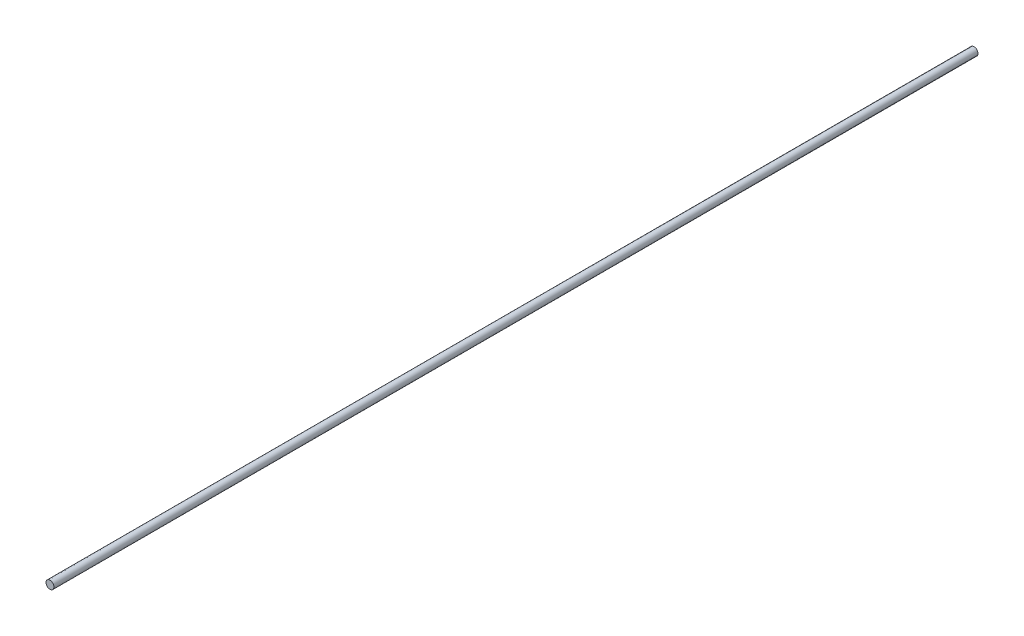
ISO-10303-21;
HEADER;
FILE_DESCRIPTION(('STEP AP214'),'2;1');
FILE_NAME('part.step','',(''),(''),'','','');
FILE_SCHEMA(('AUTOMOTIVE_DESIGN { 1 0 10303 214 1 1 1 1 }'));
ENDSEC;
DATA;
#1=APPLICATION_CONTEXT('core data for automotive mechanical design processes');
#2=APPLICATION_PROTOCOL_DEFINITION('international standard','automotive_design',2000,#1);
#3=PRODUCT_CONTEXT('',#1,'mechanical');
#4=PRODUCT('Part','Part','',(#3));
#5=PRODUCT_RELATED_PRODUCT_CATEGORY('part','',(#4));
#6=PRODUCT_DEFINITION_FORMATION('','',#4);
#7=PRODUCT_DEFINITION_CONTEXT('part definition',#1,'design');
#8=PRODUCT_DEFINITION('design','',#6,#7);
#9=PRODUCT_DEFINITION_SHAPE('','',#8);
#10=(LENGTH_UNIT() NAMED_UNIT(*) SI_UNIT(.MILLI.,.METRE.));
#11=(NAMED_UNIT(*) PLANE_ANGLE_UNIT() SI_UNIT($,.RADIAN.));
#12=(NAMED_UNIT(*) SI_UNIT($,.STERADIAN.) SOLID_ANGLE_UNIT());
#13=UNCERTAINTY_MEASURE_WITH_UNIT(LENGTH_MEASURE(1.E-05),#10,'distance_accuracy_value','');
#14=(GEOMETRIC_REPRESENTATION_CONTEXT(3) GLOBAL_UNCERTAINTY_ASSIGNED_CONTEXT((#13)) GLOBAL_UNIT_ASSIGNED_CONTEXT((#10,
#11,#12)) REPRESENTATION_CONTEXT('',''));
#15=CARTESIAN_POINT('',(0.,0.,0.));
#16=DIRECTION('',(0.,0.,1.));
#17=DIRECTION('',(1.,0.,0.));
#18=AXIS2_PLACEMENT_3D('',#15,#16,#17);
#19=CARTESIAN_POINT('',(6.5,-15.25,700.));
#20=DIRECTION('',(0.,0.,-1.));
#21=DIRECTION('',(-1.,0.,0.));
#22=AXIS2_PLACEMENT_3D('',#19,#20,#21);
#23=CYLINDRICAL_SURFACE('',#22,2.99951539375973);
#24=CARTESIAN_POINT('',(6.5,-15.25,700.));
#25=DIRECTION('',(0.,0.,1.));
#26=DIRECTION('',(1.,0.,0.));
#27=AXIS2_PLACEMENT_3D('',#24,#25,#26);
#28=CIRCLE('',#27,2.99951539375973);
#29=CARTESIAN_POINT('',(9.49951539375973,-15.25,700.));
#30=VERTEX_POINT('',#29);
#31=EDGE_CURVE('E10',#30,#30,#28,.T.);
#32=ORIENTED_EDGE('',*,*,#31,.F.);
#33=EDGE_LOOP('',(#32));
#34=FACE_BOUND('',#33,.T.);
#35=CARTESIAN_POINT('',(6.5,-15.25,0.));
#36=DIRECTION('',(0.,0.,1.));
#37=DIRECTION('',(1.,0.,0.));
#38=AXIS2_PLACEMENT_3D('',#35,#36,#37);
#39=CIRCLE('',#38,2.99951539375973);
#40=CARTESIAN_POINT('',(9.49951539375973,-15.25,0.));
#41=VERTEX_POINT('',#40);
#42=EDGE_CURVE('E34',#41,#41,#39,.T.);
#43=ORIENTED_EDGE('',*,*,#42,.T.);
#44=EDGE_LOOP('',(#43));
#45=FACE_BOUND('',#44,.T.);
#46=ADVANCED_FACE('F31',(#34,#45),#23,.T.);
#47=CARTESIAN_POINT('',(6.5,-15.25,700.));
#48=DIRECTION('',(0.,0.,1.));
#49=DIRECTION('',(1.,0.,0.));
#50=AXIS2_PLACEMENT_3D('',#47,#48,#49);
#51=PLANE('',#50);
#52=ORIENTED_EDGE('',*,*,#31,.T.);
#53=EDGE_LOOP('',(#52));
#54=FACE_BOUND('',#53,.T.);
#55=ADVANCED_FACE('F46',(#54),#51,.T.);
#56=CARTESIAN_POINT('',(6.5,-15.25,0.));
#57=DIRECTION('',(0.,0.,1.));
#58=DIRECTION('',(1.,0.,0.));
#59=AXIS2_PLACEMENT_3D('',#56,#57,#58);
#60=PLANE('',#59);
#61=ORIENTED_EDGE('',*,*,#42,.F.);
#62=EDGE_LOOP('',(#61));
#63=FACE_BOUND('',#62,.T.);
#64=ADVANCED_FACE('F44',(#63),#60,.F.);
#65=CLOSED_SHELL('',(#46,#55,#64));
#66=MANIFOLD_SOLID_BREP('B2',#65);
#67=ADVANCED_BREP_SHAPE_REPRESENTATION('',(#18,#66),#14);
#68=SHAPE_DEFINITION_REPRESENTATION(#9,#67);
ENDSEC;
END-ISO-10303-21;
